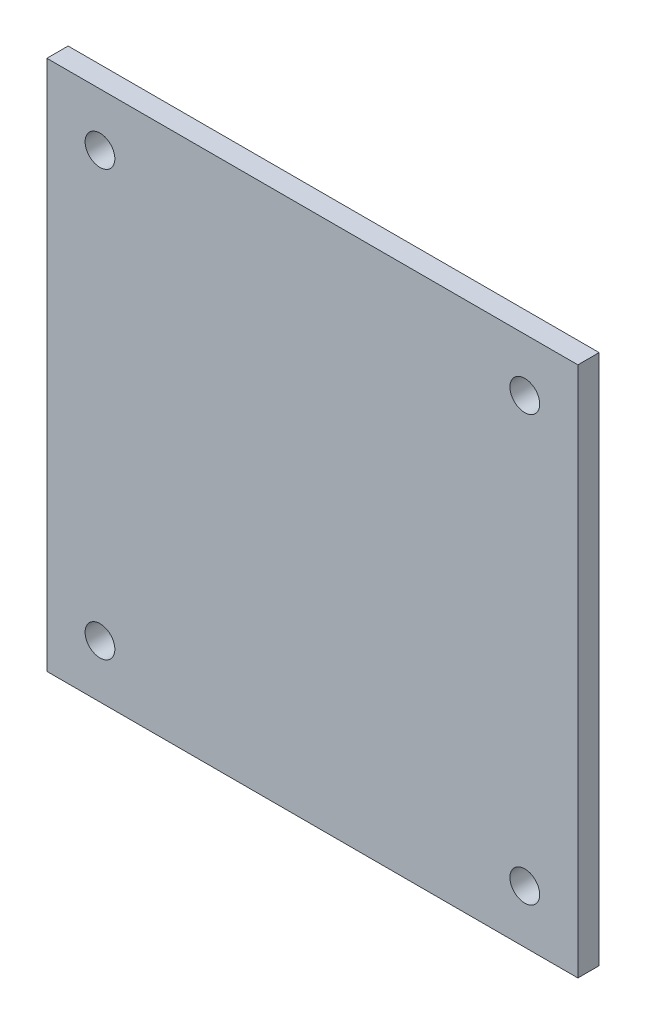
ISO-10303-21;
HEADER;
FILE_DESCRIPTION(('STEP AP214'),'2;1');
FILE_NAME('part.step','',(''),(''),'','','');
FILE_SCHEMA(('AUTOMOTIVE_DESIGN { 1 0 10303 214 1 1 1 1 }'));
ENDSEC;
DATA;
#1=APPLICATION_CONTEXT('core data for automotive mechanical design processes');
#2=APPLICATION_PROTOCOL_DEFINITION('international standard','automotive_design',2000,#1);
#3=PRODUCT_CONTEXT('',#1,'mechanical');
#4=PRODUCT('Part','Part','',(#3));
#5=PRODUCT_RELATED_PRODUCT_CATEGORY('part','',(#4));
#6=PRODUCT_DEFINITION_FORMATION('','',#4);
#7=PRODUCT_DEFINITION_CONTEXT('part definition',#1,'design');
#8=PRODUCT_DEFINITION('design','',#6,#7);
#9=PRODUCT_DEFINITION_SHAPE('','',#8);
#10=(LENGTH_UNIT() NAMED_UNIT(*) SI_UNIT(.MILLI.,.METRE.));
#11=(NAMED_UNIT(*) PLANE_ANGLE_UNIT() SI_UNIT($,.RADIAN.));
#12=(NAMED_UNIT(*) SI_UNIT($,.STERADIAN.) SOLID_ANGLE_UNIT());
#13=UNCERTAINTY_MEASURE_WITH_UNIT(LENGTH_MEASURE(1.E-05),#10,'distance_accuracy_value','');
#14=(GEOMETRIC_REPRESENTATION_CONTEXT(3) GLOBAL_UNCERTAINTY_ASSIGNED_CONTEXT((#13)) GLOBAL_UNIT_ASSIGNED_CONTEXT((#10,
#11,#12)) REPRESENTATION_CONTEXT('',''));
#15=CARTESIAN_POINT('',(0.,0.,0.));
#16=DIRECTION('',(0.,0.,1.));
#17=DIRECTION('',(1.,0.,0.));
#18=AXIS2_PLACEMENT_3D('',#15,#16,#17);
#19=CARTESIAN_POINT('',(100.,-1900.,149.9));
#20=DIRECTION('',(0.,0.,-1.));
#21=DIRECTION('',(1.,0.,0.));
#22=AXIS2_PLACEMENT_3D('',#19,#20,#21);
#23=CYLINDRICAL_SURFACE('',#22,7.);
#24=CARTESIAN_POINT('',(100.,-1900.,150.));
#25=DIRECTION('',(0.,0.,-1.));
#26=DIRECTION('',(1.,0.,0.));
#27=AXIS2_PLACEMENT_3D('',#24,#25,#26);
#28=CIRCLE('',#27,7.);
#29=CARTESIAN_POINT('',(107.,-1900.,150.));
#30=VERTEX_POINT('',#29);
#31=EDGE_CURVE('E101',#30,#30,#28,.T.);
#32=ORIENTED_EDGE('',*,*,#31,.T.);
#33=DIRECTION('',(0.,0.,1.));
#34=VECTOR('',#33,1.);
#35=CARTESIAN_POINT('',(107.,-1900.,149.9));
#36=LINE('',#35,#34);
#37=CARTESIAN_POINT('',(107.,-1900.,160.));
#38=VERTEX_POINT('',#37);
#39=EDGE_CURVE('E11',#30,#38,#36,.T.);
#40=ORIENTED_EDGE('',*,*,#39,.T.);
#41=CARTESIAN_POINT('',(100.,-1900.,160.));
#42=DIRECTION('',(0.,0.,-1.));
#43=DIRECTION('',(1.,0.,0.));
#44=AXIS2_PLACEMENT_3D('',#41,#42,#43);
#45=CIRCLE('',#44,7.);
#46=EDGE_CURVE('E99',#38,#38,#45,.T.);
#47=ORIENTED_EDGE('',*,*,#46,.F.);
#48=ORIENTED_EDGE('',*,*,#39,.F.);
#49=EDGE_LOOP('',(#32,#40,#47,#48));
#50=FACE_BOUND('',#49,.T.);
#51=ADVANCED_FACE('F17',(#50),#23,.F.);
#52=CARTESIAN_POINT('',(-100.,-1900.,149.9));
#53=DIRECTION('',(0.,0.,-1.));
#54=DIRECTION('',(1.,0.,0.));
#55=AXIS2_PLACEMENT_3D('',#52,#53,#54);
#56=CYLINDRICAL_SURFACE('',#55,7.);
#57=CARTESIAN_POINT('',(-100.,-1900.,150.));
#58=DIRECTION('',(0.,0.,-1.));
#59=DIRECTION('',(1.,0.,0.));
#60=AXIS2_PLACEMENT_3D('',#57,#58,#59);
#61=CIRCLE('',#60,7.);
#62=CARTESIAN_POINT('',(-93.,-1900.,150.));
#63=VERTEX_POINT('',#62);
#64=EDGE_CURVE('E160',#63,#63,#61,.T.);
#65=ORIENTED_EDGE('',*,*,#64,.T.);
#66=DIRECTION('',(0.,0.,1.));
#67=VECTOR('',#66,1.);
#68=CARTESIAN_POINT('',(-93.,-1900.,149.9));
#69=LINE('',#68,#67);
#70=CARTESIAN_POINT('',(-93.,-1900.,160.));
#71=VERTEX_POINT('',#70);
#72=EDGE_CURVE('E25',#63,#71,#69,.T.);
#73=ORIENTED_EDGE('',*,*,#72,.T.);
#74=CARTESIAN_POINT('',(-100.,-1900.,160.));
#75=DIRECTION('',(0.,0.,-1.));
#76=DIRECTION('',(1.,0.,0.));
#77=AXIS2_PLACEMENT_3D('',#74,#75,#76);
#78=CIRCLE('',#77,7.);
#79=EDGE_CURVE('E107',#71,#71,#78,.T.);
#80=ORIENTED_EDGE('',*,*,#79,.F.);
#81=ORIENTED_EDGE('',*,*,#72,.F.);
#82=EDGE_LOOP('',(#65,#73,#80,#81));
#83=FACE_BOUND('',#82,.T.);
#84=ADVANCED_FACE('F168',(#83),#56,.F.);
#85=CARTESIAN_POINT('',(100.,-2100.,149.9));
#86=DIRECTION('',(0.,0.,-1.));
#87=DIRECTION('',(1.,0.,0.));
#88=AXIS2_PLACEMENT_3D('',#85,#86,#87);
#89=CYLINDRICAL_SURFACE('',#88,7.);
#90=CARTESIAN_POINT('',(100.,-2100.,150.));
#91=DIRECTION('',(0.,0.,-1.));
#92=DIRECTION('',(1.,0.,0.));
#93=AXIS2_PLACEMENT_3D('',#90,#91,#92);
#94=CIRCLE('',#93,7.);
#95=CARTESIAN_POINT('',(107.,-2100.,150.));
#96=VERTEX_POINT('',#95);
#97=EDGE_CURVE('E155',#96,#96,#94,.T.);
#98=ORIENTED_EDGE('',*,*,#97,.T.);
#99=DIRECTION('',(0.,0.,1.));
#100=VECTOR('',#99,1.);
#101=CARTESIAN_POINT('',(107.,-2100.,149.9));
#102=LINE('',#101,#100);
#103=CARTESIAN_POINT('',(107.,-2100.,160.));
#104=VERTEX_POINT('',#103);
#105=EDGE_CURVE('E144',#96,#104,#102,.T.);
#106=ORIENTED_EDGE('',*,*,#105,.T.);
#107=CARTESIAN_POINT('',(100.,-2100.,160.));
#108=DIRECTION('',(0.,0.,-1.));
#109=DIRECTION('',(1.,0.,0.));
#110=AXIS2_PLACEMENT_3D('',#107,#108,#109);
#111=CIRCLE('',#110,7.);
#112=EDGE_CURVE('E118',#104,#104,#111,.T.);
#113=ORIENTED_EDGE('',*,*,#112,.F.);
#114=ORIENTED_EDGE('',*,*,#105,.F.);
#115=EDGE_LOOP('',(#98,#106,#113,#114));
#116=FACE_BOUND('',#115,.T.);
#117=ADVANCED_FACE('F233',(#116),#89,.F.);
#118=CARTESIAN_POINT('',(-100.,-2100.,149.9));
#119=DIRECTION('',(0.,0.,-1.));
#120=DIRECTION('',(1.,0.,0.));
#121=AXIS2_PLACEMENT_3D('',#118,#119,#120);
#122=CYLINDRICAL_SURFACE('',#121,7.);
#123=CARTESIAN_POINT('',(-100.,-2100.,150.));
#124=DIRECTION('',(0.,0.,-1.));
#125=DIRECTION('',(1.,0.,0.));
#126=AXIS2_PLACEMENT_3D('',#123,#124,#125);
#127=CIRCLE('',#126,7.);
#128=CARTESIAN_POINT('',(-93.,-2100.,150.));
#129=VERTEX_POINT('',#128);
#130=EDGE_CURVE('E151',#129,#129,#127,.T.);
#131=ORIENTED_EDGE('',*,*,#130,.T.);
#132=DIRECTION('',(0.,0.,1.));
#133=VECTOR('',#132,1.);
#134=CARTESIAN_POINT('',(-93.,-2100.,149.9));
#135=LINE('',#134,#133);
#136=CARTESIAN_POINT('',(-93.,-2100.,160.));
#137=VERTEX_POINT('',#136);
#138=EDGE_CURVE('E147',#129,#137,#135,.T.);
#139=ORIENTED_EDGE('',*,*,#138,.T.);
#140=CARTESIAN_POINT('',(-100.,-2100.,160.));
#141=DIRECTION('',(0.,0.,-1.));
#142=DIRECTION('',(1.,0.,0.));
#143=AXIS2_PLACEMENT_3D('',#140,#141,#142);
#144=CIRCLE('',#143,7.);
#145=EDGE_CURVE('E140',#137,#137,#144,.T.);
#146=ORIENTED_EDGE('',*,*,#145,.F.);
#147=ORIENTED_EDGE('',*,*,#138,.F.);
#148=EDGE_LOOP('',(#131,#139,#146,#147));
#149=FACE_BOUND('',#148,.T.);
#150=ADVANCED_FACE('F225',(#149),#122,.F.);
#151=CARTESIAN_POINT('',(125.,-2125.,150.));
#152=DIRECTION('',(1.,0.,0.));
#153=DIRECTION('',(0.,1.,0.));
#154=AXIS2_PLACEMENT_3D('',#151,#152,#153);
#155=PLANE('',#154);
#156=DIRECTION('',(0.,0.,1.));
#157=VECTOR('',#156,1.);
#158=CARTESIAN_POINT('',(125.,-2125.,150.));
#159=LINE('',#158,#157);
#160=CARTESIAN_POINT('',(125.,-2125.,150.));
#161=VERTEX_POINT('',#160);
#162=CARTESIAN_POINT('',(125.,-2125.,160.));
#163=VERTEX_POINT('',#162);
#164=EDGE_CURVE('E128',#161,#163,#159,.T.);
#165=ORIENTED_EDGE('',*,*,#164,.F.);
#166=DIRECTION('',(0.,1.,0.));
#167=VECTOR('',#166,1.);
#168=CARTESIAN_POINT('',(125.,-2125.,150.));
#169=LINE('',#168,#167);
#170=CARTESIAN_POINT('',(125.,-1875.,150.));
#171=VERTEX_POINT('',#170);
#172=EDGE_CURVE('E156',#161,#171,#169,.T.);
#173=ORIENTED_EDGE('',*,*,#172,.T.);
#174=DIRECTION('',(0.,0.,1.));
#175=VECTOR('',#174,1.);
#176=CARTESIAN_POINT('',(125.,-1875.,150.));
#177=LINE('',#176,#175);
#178=CARTESIAN_POINT('',(125.,-1875.,160.));
#179=VERTEX_POINT('',#178);
#180=EDGE_CURVE('E114',#171,#179,#177,.T.);
#181=ORIENTED_EDGE('',*,*,#180,.T.);
#182=DIRECTION('',(0.,1.,0.));
#183=VECTOR('',#182,1.);
#184=CARTESIAN_POINT('',(125.,-2125.,160.));
#185=LINE('',#184,#183);
#186=EDGE_CURVE('E132',#163,#179,#185,.T.);
#187=ORIENTED_EDGE('',*,*,#186,.F.);
#188=EDGE_LOOP('',(#165,#173,#181,#187));
#189=FACE_BOUND('',#188,.T.);
#190=ADVANCED_FACE('F211',(#189),#155,.T.);
#191=CARTESIAN_POINT('',(-125.,-2125.,150.));
#192=DIRECTION('',(0.,0.,1.));
#193=DIRECTION('',(1.,0.,0.));
#194=AXIS2_PLACEMENT_3D('',#191,#192,#193);
#195=PLANE('',#194);
#196=ORIENTED_EDGE('',*,*,#31,.F.);
#197=EDGE_LOOP('',(#196));
#198=FACE_BOUND('',#197,.T.);
#199=ORIENTED_EDGE('',*,*,#64,.F.);
#200=EDGE_LOOP('',(#199));
#201=FACE_BOUND('',#200,.T.);
#202=ORIENTED_EDGE('',*,*,#97,.F.);
#203=EDGE_LOOP('',(#202));
#204=FACE_BOUND('',#203,.T.);
#205=ORIENTED_EDGE('',*,*,#130,.F.);
#206=EDGE_LOOP('',(#205));
#207=FACE_BOUND('',#206,.T.);
#208=DIRECTION('',(1.,0.,0.));
#209=VECTOR('',#208,1.);
#210=CARTESIAN_POINT('',(-125.,-1875.,150.));
#211=LINE('',#210,#209);
#212=CARTESIAN_POINT('',(-125.,-1875.,150.));
#213=VERTEX_POINT('',#212);
#214=EDGE_CURVE('E106',#213,#171,#211,.T.);
#215=ORIENTED_EDGE('',*,*,#214,.T.);
#216=ORIENTED_EDGE('',*,*,#172,.F.);
#217=DIRECTION('',(1.,0.,0.));
#218=VECTOR('',#217,1.);
#219=CARTESIAN_POINT('',(-125.,-2125.,150.));
#220=LINE('',#219,#218);
#221=CARTESIAN_POINT('',(-125.,-2125.,150.));
#222=VERTEX_POINT('',#221);
#223=EDGE_CURVE('E127',#222,#161,#220,.T.);
#224=ORIENTED_EDGE('',*,*,#223,.F.);
#225=DIRECTION('',(0.,1.,0.));
#226=VECTOR('',#225,1.);
#227=CARTESIAN_POINT('',(-125.,-2125.,150.));
#228=LINE('',#227,#226);
#229=EDGE_CURVE('E192',#222,#213,#228,.T.);
#230=ORIENTED_EDGE('',*,*,#229,.T.);
#231=EDGE_LOOP('',(#215,#216,#224,#230));
#232=FACE_BOUND('',#231,.T.);
#233=ADVANCED_FACE('F214',(#198,#201,#204,#207,#232),#195,.F.);
#234=CARTESIAN_POINT('',(-125.,-1875.,150.));
#235=DIRECTION('',(0.,1.,0.));
#236=DIRECTION('',(1.,0.,0.));
#237=AXIS2_PLACEMENT_3D('',#234,#235,#236);
#238=PLANE('',#237);
#239=ORIENTED_EDGE('',*,*,#214,.F.);
#240=DIRECTION('',(0.,0.,1.));
#241=VECTOR('',#240,1.);
#242=CARTESIAN_POINT('',(-125.,-1875.,150.));
#243=LINE('',#242,#241);
#244=CARTESIAN_POINT('',(-125.,-1875.,160.));
#245=VERTEX_POINT('',#244);
#246=EDGE_CURVE('E188',#213,#245,#243,.T.);
#247=ORIENTED_EDGE('',*,*,#246,.T.);
#248=DIRECTION('',(1.,0.,0.));
#249=VECTOR('',#248,1.);
#250=CARTESIAN_POINT('',(-125.,-1875.,160.));
#251=LINE('',#250,#249);
#252=EDGE_CURVE('E136',#245,#179,#251,.T.);
#253=ORIENTED_EDGE('',*,*,#252,.T.);
#254=ORIENTED_EDGE('',*,*,#180,.F.);
#255=EDGE_LOOP('',(#239,#247,#253,#254));
#256=FACE_BOUND('',#255,.T.);
#257=ADVANCED_FACE('F173',(#256),#238,.T.);
#258=CARTESIAN_POINT('',(-125.,-2125.,160.));
#259=DIRECTION('',(0.,0.,1.));
#260=DIRECTION('',(1.,0.,0.));
#261=AXIS2_PLACEMENT_3D('',#258,#259,#260);
#262=PLANE('',#261);
#263=ORIENTED_EDGE('',*,*,#46,.T.);
#264=EDGE_LOOP('',(#263));
#265=FACE_BOUND('',#264,.T.);
#266=ORIENTED_EDGE('',*,*,#79,.T.);
#267=EDGE_LOOP('',(#266));
#268=FACE_BOUND('',#267,.T.);
#269=ORIENTED_EDGE('',*,*,#112,.T.);
#270=EDGE_LOOP('',(#269));
#271=FACE_BOUND('',#270,.T.);
#272=ORIENTED_EDGE('',*,*,#145,.T.);
#273=EDGE_LOOP('',(#272));
#274=FACE_BOUND('',#273,.T.);
#275=DIRECTION('',(0.,1.,0.));
#276=VECTOR('',#275,1.);
#277=CARTESIAN_POINT('',(-125.,-2125.,160.));
#278=LINE('',#277,#276);
#279=CARTESIAN_POINT('',(-125.,-2125.,160.));
#280=VERTEX_POINT('',#279);
#281=EDGE_CURVE('E181',#280,#245,#278,.T.);
#282=ORIENTED_EDGE('',*,*,#281,.F.);
#283=DIRECTION('',(1.,0.,0.));
#284=VECTOR('',#283,1.);
#285=CARTESIAN_POINT('',(-125.,-2125.,160.));
#286=LINE('',#285,#284);
#287=EDGE_CURVE('E124',#280,#163,#286,.T.);
#288=ORIENTED_EDGE('',*,*,#287,.T.);
#289=ORIENTED_EDGE('',*,*,#186,.T.);
#290=ORIENTED_EDGE('',*,*,#252,.F.);
#291=EDGE_LOOP('',(#282,#288,#289,#290));
#292=FACE_BOUND('',#291,.T.);
#293=ADVANCED_FACE('F103',(#265,#268,#271,#274,#292),#262,.T.);
#294=CARTESIAN_POINT('',(-125.,-2125.,150.));
#295=DIRECTION('',(0.,1.,0.));
#296=DIRECTION('',(1.,0.,0.));
#297=AXIS2_PLACEMENT_3D('',#294,#295,#296);
#298=PLANE('',#297);
#299=ORIENTED_EDGE('',*,*,#164,.T.);
#300=ORIENTED_EDGE('',*,*,#287,.F.);
#301=DIRECTION('',(0.,0.,1.));
#302=VECTOR('',#301,1.);
#303=CARTESIAN_POINT('',(-125.,-2125.,150.));
#304=LINE('',#303,#302);
#305=EDGE_CURVE('E122',#222,#280,#304,.T.);
#306=ORIENTED_EDGE('',*,*,#305,.F.);
#307=ORIENTED_EDGE('',*,*,#223,.T.);
#308=EDGE_LOOP('',(#299,#300,#306,#307));
#309=FACE_BOUND('',#308,.T.);
#310=ADVANCED_FACE('F172',(#309),#298,.F.);
#311=CARTESIAN_POINT('',(-125.,-2125.,150.));
#312=DIRECTION('',(1.,0.,0.));
#313=DIRECTION('',(0.,1.,0.));
#314=AXIS2_PLACEMENT_3D('',#311,#312,#313);
#315=PLANE('',#314);
#316=ORIENTED_EDGE('',*,*,#281,.T.);
#317=ORIENTED_EDGE('',*,*,#246,.F.);
#318=ORIENTED_EDGE('',*,*,#229,.F.);
#319=ORIENTED_EDGE('',*,*,#305,.T.);
#320=EDGE_LOOP('',(#316,#317,#318,#319));
#321=FACE_BOUND('',#320,.T.);
#322=ADVANCED_FACE('F208',(#321),#315,.F.);
#323=CLOSED_SHELL('',(#51,#84,#117,#150,#190,#233,#257,#293,#310,#322));
#324=MANIFOLD_SOLID_BREP('B1',#323);
#325=ADVANCED_BREP_SHAPE_REPRESENTATION('',(#18,#324),#14);
#326=SHAPE_DEFINITION_REPRESENTATION(#9,#325);
ENDSEC;
END-ISO-10303-21;
